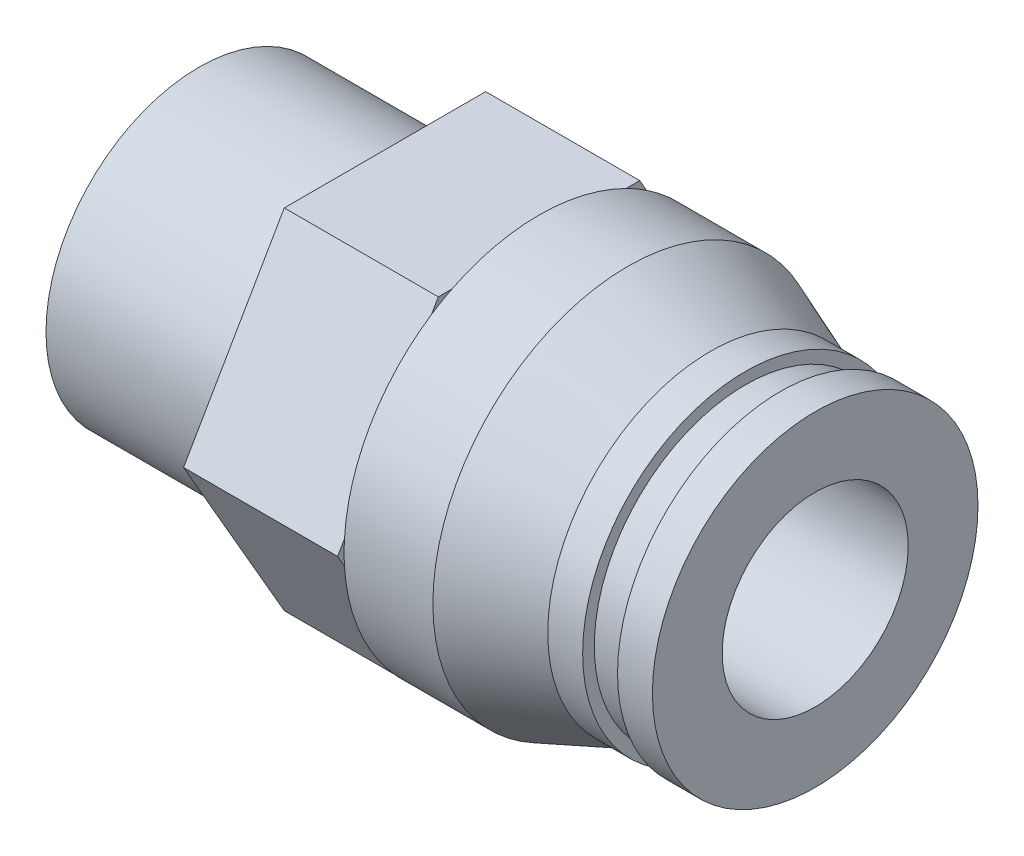
ISO-10303-21;
HEADER;
FILE_DESCRIPTION(('STEP AP214'),'2;1');
FILE_NAME('part.step','',(''),(''),'','','');
FILE_SCHEMA(('AUTOMOTIVE_DESIGN { 1 0 10303 214 1 1 1 1 }'));
ENDSEC;
DATA;
#1=APPLICATION_CONTEXT('core data for automotive mechanical design processes');
#2=APPLICATION_PROTOCOL_DEFINITION('international standard','automotive_design',2000,#1);
#3=PRODUCT_CONTEXT('',#1,'mechanical');
#4=PRODUCT('Part','Part','',(#3));
#5=PRODUCT_RELATED_PRODUCT_CATEGORY('part','',(#4));
#6=PRODUCT_DEFINITION_FORMATION('','',#4);
#7=PRODUCT_DEFINITION_CONTEXT('part definition',#1,'design');
#8=PRODUCT_DEFINITION('design','',#6,#7);
#9=PRODUCT_DEFINITION_SHAPE('','',#8);
#10=(LENGTH_UNIT() NAMED_UNIT(*) SI_UNIT(.MILLI.,.METRE.));
#11=(NAMED_UNIT(*) PLANE_ANGLE_UNIT() SI_UNIT($,.RADIAN.));
#12=(NAMED_UNIT(*) SI_UNIT($,.STERADIAN.) SOLID_ANGLE_UNIT());
#13=UNCERTAINTY_MEASURE_WITH_UNIT(LENGTH_MEASURE(1.E-05),#10,'distance_accuracy_value','');
#14=(GEOMETRIC_REPRESENTATION_CONTEXT(3) GLOBAL_UNCERTAINTY_ASSIGNED_CONTEXT((#13)) GLOBAL_UNIT_ASSIGNED_CONTEXT((#10,
#11,#12)) REPRESENTATION_CONTEXT('',''));
#15=CARTESIAN_POINT('',(0.,0.,0.));
#16=DIRECTION('',(0.,0.,1.));
#17=DIRECTION('',(1.,0.,0.));
#18=AXIS2_PLACEMENT_3D('',#15,#16,#17);
#19=CARTESIAN_POINT('',(8.,6.575,0.));
#20=DIRECTION('',(-1.,0.,0.));
#21=DIRECTION('',(0.,0.,1.));
#22=AXIS2_PLACEMENT_3D('',#19,#20,#21);
#23=PLANE('',#22);
#24=CARTESIAN_POINT('',(8.,0.,0.));
#25=DIRECTION('',(1.,0.,0.));
#26=DIRECTION('',(0.,0.,-1.));
#27=AXIS2_PLACEMENT_3D('',#24,#25,#26);
#28=CIRCLE('',#27,6.575);
#29=CARTESIAN_POINT('',(8.,0.,-6.575));
#30=VERTEX_POINT('',#29);
#31=EDGE_CURVE('E271',#30,#30,#28,.T.);
#32=ORIENTED_EDGE('',*,*,#31,.T.);
#33=EDGE_LOOP('',(#32));
#34=FACE_BOUND('',#33,.T.);
#35=DIRECTION('',(0.,-0.866025403784439,0.5));
#36=VECTOR('',#35,1.);
#37=CARTESIAN_POINT('',(8.,0.,-8.66025403784439));
#38=LINE('',#37,#36);
#39=CARTESIAN_POINT('',(8.,0.,-8.66025403784439));
#40=VERTEX_POINT('',#39);
#41=CARTESIAN_POINT('',(8.,-7.5,-4.33012701892219));
#42=VERTEX_POINT('',#41);
#43=EDGE_CURVE('E165',#40,#42,#38,.T.);
#44=ORIENTED_EDGE('',*,*,#43,.T.);
#45=DIRECTION('',(0.,0.,1.));
#46=VECTOR('',#45,1.);
#47=CARTESIAN_POINT('',(8.,-7.5,-4.33012701892219));
#48=LINE('',#47,#46);
#49=CARTESIAN_POINT('',(8.,-7.5,4.3301270189222));
#50=VERTEX_POINT('',#49);
#51=EDGE_CURVE('E147',#42,#50,#48,.T.);
#52=ORIENTED_EDGE('',*,*,#51,.T.);
#53=DIRECTION('',(0.,0.866025403784439,0.5));
#54=VECTOR('',#53,1.);
#55=CARTESIAN_POINT('',(8.,-7.5,4.3301270189222));
#56=LINE('',#55,#54);
#57=CARTESIAN_POINT('',(8.,0.,8.66025403784439));
#58=VERTEX_POINT('',#57);
#59=EDGE_CURVE('E159',#50,#58,#56,.T.);
#60=ORIENTED_EDGE('',*,*,#59,.T.);
#61=DIRECTION('',(0.,0.866025403784439,-0.5));
#62=VECTOR('',#61,1.);
#63=CARTESIAN_POINT('',(8.,0.,8.66025403784439));
#64=LINE('',#63,#62);
#65=CARTESIAN_POINT('',(8.,7.5,4.33012701892219));
#66=VERTEX_POINT('',#65);
#67=EDGE_CURVE('E31',#58,#66,#64,.T.);
#68=ORIENTED_EDGE('',*,*,#67,.T.);
#69=DIRECTION('',(0.,0.,-1.));
#70=VECTOR('',#69,1.);
#71=CARTESIAN_POINT('',(8.,7.5,4.33012701892219));
#72=LINE('',#71,#70);
#73=CARTESIAN_POINT('',(8.,7.5,-4.3301270189222));
#74=VERTEX_POINT('',#73);
#75=EDGE_CURVE('E169',#66,#74,#72,.T.);
#76=ORIENTED_EDGE('',*,*,#75,.T.);
#77=DIRECTION('',(0.,-0.866025403784439,-0.5));
#78=VECTOR('',#77,1.);
#79=CARTESIAN_POINT('',(8.,7.5,-4.3301270189222));
#80=LINE('',#79,#78);
#81=EDGE_CURVE('E172',#74,#40,#80,.T.);
#82=ORIENTED_EDGE('',*,*,#81,.T.);
#83=EDGE_LOOP('',(#44,#52,#60,#68,#76,#82));
#84=FACE_BOUND('',#83,.T.);
#85=ADVANCED_FACE('F16',(#34,#84),#23,.T.);
#86=CARTESIAN_POINT('',(14.625,9.5,0.));
#87=DIRECTION('',(1.,0.,0.));
#88=DIRECTION('',(0.,0.,-1.));
#89=AXIS2_PLACEMENT_3D('',#86,#87,#88);
#90=PLANE('',#89);
#91=CARTESIAN_POINT('',(14.625,0.,0.));
#92=DIRECTION('',(1.,0.,0.));
#93=DIRECTION('',(0.,0.,-1.));
#94=AXIS2_PLACEMENT_3D('',#91,#92,#93);
#95=CIRCLE('',#94,8.38207981062587);
#96=CARTESIAN_POINT('',(14.625,-7.5,-3.7428948624964));
#97=VERTEX_POINT('',#96);
#98=CARTESIAN_POINT('',(14.625,-6.99144203461614,-4.62374309713509));
#99=VERTEX_POINT('',#98);
#100=EDGE_CURVE('E382',#97,#99,#95,.T.);
#101=ORIENTED_EDGE('',*,*,#100,.F.);
#102=DIRECTION('',(0.,0.,1.));
#103=VECTOR('',#102,1.);
#104=CARTESIAN_POINT('',(14.625,-7.5,-4.33012701892219));
#105=LINE('',#104,#103);
#106=CARTESIAN_POINT('',(14.625,-7.5,-4.33012701892219));
#107=VERTEX_POINT('',#106);
#108=EDGE_CURVE('E175',#107,#97,#105,.T.);
#109=ORIENTED_EDGE('',*,*,#108,.F.);
#110=DIRECTION('',(0.,-0.866025403784439,0.5));
#111=VECTOR('',#110,1.);
#112=CARTESIAN_POINT('',(14.625,0.,-8.66025403784439));
#113=LINE('',#112,#111);
#114=EDGE_CURVE('E195',#99,#107,#113,.T.);
#115=ORIENTED_EDGE('',*,*,#114,.F.);
#116=EDGE_LOOP('',(#101,#109,#115));
#117=FACE_BOUND('',#116,.T.);
#118=ADVANCED_FACE('F326',(#117),#90,.T.);
#119=CARTESIAN_POINT('',(14.625,-0.508557965383857,-8.36663795963149));
#120=VERTEX_POINT('',#119);
#121=CARTESIAN_POINT('',(14.625,0.50855796538386,-8.36663795963149));
#122=VERTEX_POINT('',#121);
#123=EDGE_CURVE('E267',#120,#122,#95,.T.);
#124=ORIENTED_EDGE('',*,*,#123,.F.);
#125=CARTESIAN_POINT('',(14.625,0.,-8.66025403784439));
#126=VERTEX_POINT('',#125);
#127=EDGE_CURVE('E156',#126,#120,#113,.T.);
#128=ORIENTED_EDGE('',*,*,#127,.F.);
#129=DIRECTION('',(0.,-0.866025403784439,-0.5));
#130=VECTOR('',#129,1.);
#131=CARTESIAN_POINT('',(14.625,7.5,-4.3301270189222));
#132=LINE('',#131,#130);
#133=EDGE_CURVE('E190',#122,#126,#132,.T.);
#134=ORIENTED_EDGE('',*,*,#133,.F.);
#135=EDGE_LOOP('',(#124,#128,#134));
#136=FACE_BOUND('',#135,.T.);
#137=ADVANCED_FACE('F332',(#136),#90,.T.);
#138=CARTESIAN_POINT('',(14.625,6.99144203461614,-4.62374309713509));
#139=VERTEX_POINT('',#138);
#140=CARTESIAN_POINT('',(14.625,7.5,-3.74289486249639));
#141=VERTEX_POINT('',#140);
#142=EDGE_CURVE('E272',#139,#141,#95,.T.);
#143=ORIENTED_EDGE('',*,*,#142,.F.);
#144=CARTESIAN_POINT('',(14.625,7.5,-4.3301270189222));
#145=VERTEX_POINT('',#144);
#146=EDGE_CURVE('E192',#145,#139,#132,.T.);
#147=ORIENTED_EDGE('',*,*,#146,.F.);
#148=DIRECTION('',(0.,0.,-1.));
#149=VECTOR('',#148,1.);
#150=CARTESIAN_POINT('',(14.625,7.5,4.33012701892219));
#151=LINE('',#150,#149);
#152=EDGE_CURVE('E185',#141,#145,#151,.T.);
#153=ORIENTED_EDGE('',*,*,#152,.F.);
#154=EDGE_LOOP('',(#143,#147,#153));
#155=FACE_BOUND('',#154,.T.);
#156=ADVANCED_FACE('F444',(#155),#90,.T.);
#157=CARTESIAN_POINT('',(14.625,7.5,3.74289486249639));
#158=VERTEX_POINT('',#157);
#159=CARTESIAN_POINT('',(14.625,6.99144203461614,4.62374309713509));
#160=VERTEX_POINT('',#159);
#161=EDGE_CURVE('E379',#158,#160,#95,.T.);
#162=ORIENTED_EDGE('',*,*,#161,.F.);
#163=CARTESIAN_POINT('',(14.625,7.5,4.33012701892219));
#164=VERTEX_POINT('',#163);
#165=EDGE_CURVE('E187',#164,#158,#151,.T.);
#166=ORIENTED_EDGE('',*,*,#165,.F.);
#167=DIRECTION('',(0.,0.866025403784439,-0.5));
#168=VECTOR('',#167,1.);
#169=CARTESIAN_POINT('',(14.625,0.,8.66025403784439));
#170=LINE('',#169,#168);
#171=EDGE_CURVE('E182',#160,#164,#170,.T.);
#172=ORIENTED_EDGE('',*,*,#171,.F.);
#173=EDGE_LOOP('',(#162,#166,#172));
#174=FACE_BOUND('',#173,.T.);
#175=ADVANCED_FACE('F362',(#174),#90,.T.);
#176=CARTESIAN_POINT('',(14.625,0.508557965383864,8.36663795963149));
#177=VERTEX_POINT('',#176);
#178=CARTESIAN_POINT('',(14.625,-0.508557965383863,8.36663795963149));
#179=VERTEX_POINT('',#178);
#180=EDGE_CURVE('E373',#177,#179,#95,.T.);
#181=ORIENTED_EDGE('',*,*,#180,.F.);
#182=CARTESIAN_POINT('',(14.625,0.,8.66025403784439));
#183=VERTEX_POINT('',#182);
#184=EDGE_CURVE('E37',#183,#177,#170,.T.);
#185=ORIENTED_EDGE('',*,*,#184,.F.);
#186=DIRECTION('',(0.,0.866025403784439,0.5));
#187=VECTOR('',#186,1.);
#188=CARTESIAN_POINT('',(14.625,-7.5,4.3301270189222));
#189=LINE('',#188,#187);
#190=EDGE_CURVE('E178',#179,#183,#189,.T.);
#191=ORIENTED_EDGE('',*,*,#190,.F.);
#192=EDGE_LOOP('',(#181,#185,#191));
#193=FACE_BOUND('',#192,.T.);
#194=ADVANCED_FACE('F357',(#193),#90,.T.);
#195=CARTESIAN_POINT('',(14.625,-7.5,4.3301270189222));
#196=VERTEX_POINT('',#195);
#197=CARTESIAN_POINT('',(14.625,-6.99144203461614,4.62374309713509));
#198=VERTEX_POINT('',#197);
#199=EDGE_CURVE('E180',#196,#198,#189,.T.);
#200=ORIENTED_EDGE('',*,*,#199,.F.);
#201=CARTESIAN_POINT('',(14.625,-7.5,3.74289486249639));
#202=VERTEX_POINT('',#201);
#203=EDGE_CURVE('E151',#202,#196,#105,.T.);
#204=ORIENTED_EDGE('',*,*,#203,.F.);
#205=EDGE_CURVE('E366',#198,#202,#95,.T.);
#206=ORIENTED_EDGE('',*,*,#205,.F.);
#207=EDGE_LOOP('',(#200,#204,#206));
#208=FACE_BOUND('',#207,.T.);
#209=ADVANCED_FACE('F335',(#208),#90,.T.);
#210=CARTESIAN_POINT('',(0.,0.,0.));
#211=DIRECTION('',(-1.,0.,0.));
#212=DIRECTION('',(0.,0.,1.));
#213=AXIS2_PLACEMENT_3D('',#210,#211,#212);
#214=PLANE('',#213);
#215=CARTESIAN_POINT('',(0.,0.,0.));
#216=DIRECTION('',(1.,0.,0.));
#217=DIRECTION('',(0.,0.,-1.));
#218=AXIS2_PLACEMENT_3D('',#215,#216,#217);
#219=CIRCLE('',#218,6.575);
#220=CARTESIAN_POINT('',(0.,0.,-6.575));
#221=VERTEX_POINT('',#220);
#222=EDGE_CURVE('E275',#221,#221,#219,.T.);
#223=ORIENTED_EDGE('',*,*,#222,.F.);
#224=EDGE_LOOP('',(#223));
#225=FACE_BOUND('',#224,.T.);
#226=DIRECTION('',(0.,-0.866025403784439,-0.5));
#227=VECTOR('',#226,1.);
#228=CARTESIAN_POINT('',(0.,0.,3.46410161513775));
#229=LINE('',#228,#227);
#230=CARTESIAN_POINT('',(0.,0.,3.46410161513775));
#231=VERTEX_POINT('',#230);
#232=CARTESIAN_POINT('',(0.,-3.,1.73205080756888));
#233=VERTEX_POINT('',#232);
#234=EDGE_CURVE('E224',#231,#233,#229,.T.);
#235=ORIENTED_EDGE('',*,*,#234,.T.);
#236=DIRECTION('',(0.,0.,-1.));
#237=VECTOR('',#236,1.);
#238=CARTESIAN_POINT('',(0.,-3.,1.73205080756888));
#239=LINE('',#238,#237);
#240=CARTESIAN_POINT('',(0.,-3.,-1.73205080756888));
#241=VERTEX_POINT('',#240);
#242=EDGE_CURVE('E202',#233,#241,#239,.T.);
#243=ORIENTED_EDGE('',*,*,#242,.T.);
#244=DIRECTION('',(0.,0.866025403784438,-0.5));
#245=VECTOR('',#244,1.);
#246=CARTESIAN_POINT('',(0.,-3.,-1.73205080756888));
#247=LINE('',#246,#245);
#248=CARTESIAN_POINT('',(0.,0.,-3.46410161513776));
#249=VERTEX_POINT('',#248);
#250=EDGE_CURVE('E212',#241,#249,#247,.T.);
#251=ORIENTED_EDGE('',*,*,#250,.T.);
#252=DIRECTION('',(0.,0.866025403784438,0.5));
#253=VECTOR('',#252,1.);
#254=CARTESIAN_POINT('',(0.,0.,-3.46410161513776));
#255=LINE('',#254,#253);
#256=CARTESIAN_POINT('',(0.,3.,-1.73205080756888));
#257=VERTEX_POINT('',#256);
#258=EDGE_CURVE('E215',#249,#257,#255,.T.);
#259=ORIENTED_EDGE('',*,*,#258,.T.);
#260=DIRECTION('',(0.,0.,1.));
#261=VECTOR('',#260,1.);
#262=CARTESIAN_POINT('',(0.,3.,-1.73205080756888));
#263=LINE('',#262,#261);
#264=CARTESIAN_POINT('',(0.,3.,1.73205080756888));
#265=VERTEX_POINT('',#264);
#266=EDGE_CURVE('E218',#257,#265,#263,.T.);
#267=ORIENTED_EDGE('',*,*,#266,.T.);
#268=DIRECTION('',(0.,-0.866025403784439,0.5));
#269=VECTOR('',#268,1.);
#270=CARTESIAN_POINT('',(0.,3.,1.73205080756888));
#271=LINE('',#270,#269);
#272=EDGE_CURVE('E221',#265,#231,#271,.T.);
#273=ORIENTED_EDGE('',*,*,#272,.T.);
#274=EDGE_LOOP('',(#235,#243,#251,#259,#267,#273));
#275=FACE_BOUND('',#274,.T.);
#276=ADVANCED_FACE('F18',(#225,#275),#214,.T.);
#277=CARTESIAN_POINT('',(9.,4.,0.));
#278=DIRECTION('',(1.,0.,0.));
#279=DIRECTION('',(0.,0.,-1.));
#280=AXIS2_PLACEMENT_3D('',#277,#278,#279);
#281=PLANE('',#280);
#282=CARTESIAN_POINT('',(9.,0.,0.));
#283=DIRECTION('',(1.,0.,0.));
#284=DIRECTION('',(0.,0.,-1.));
#285=AXIS2_PLACEMENT_3D('',#282,#283,#284);
#286=CIRCLE('',#285,4.);
#287=CARTESIAN_POINT('',(9.,0.,-4.));
#288=VERTEX_POINT('',#287);
#289=EDGE_CURVE('E240',#288,#288,#286,.T.);
#290=ORIENTED_EDGE('',*,*,#289,.T.);
#291=EDGE_LOOP('',(#290));
#292=FACE_BOUND('',#291,.T.);
#293=DIRECTION('',(0.,-0.866025403784438,0.5));
#294=VECTOR('',#293,1.);
#295=CARTESIAN_POINT('',(9.,1.5,-4.3301270189222));
#296=LINE('',#295,#294);
#297=CARTESIAN_POINT('',(9.,0.,-3.46410161513776));
#298=VERTEX_POINT('',#297);
#299=CARTESIAN_POINT('',(9.,-3.,-1.73205080756888));
#300=VERTEX_POINT('',#299);
#301=EDGE_CURVE('E24',#298,#300,#296,.T.);
#302=ORIENTED_EDGE('',*,*,#301,.T.);
#303=DIRECTION('',(0.,0.,1.));
#304=VECTOR('',#303,1.);
#305=CARTESIAN_POINT('',(9.,-3.,0.));
#306=LINE('',#305,#304);
#307=CARTESIAN_POINT('',(9.,-3.,1.73205080756888));
#308=VERTEX_POINT('',#307);
#309=EDGE_CURVE('E10',#300,#308,#306,.T.);
#310=ORIENTED_EDGE('',*,*,#309,.T.);
#311=DIRECTION('',(0.,0.866025403784439,0.5));
#312=VECTOR('',#311,1.);
#313=CARTESIAN_POINT('',(9.,1.5,4.33012701892219));
#314=LINE('',#313,#312);
#315=CARTESIAN_POINT('',(9.,0.,3.46410161513775));
#316=VERTEX_POINT('',#315);
#317=EDGE_CURVE('E278',#308,#316,#314,.T.);
#318=ORIENTED_EDGE('',*,*,#317,.T.);
#319=DIRECTION('',(0.,0.866025403784439,-0.5));
#320=VECTOR('',#319,1.);
#321=CARTESIAN_POINT('',(9.,4.5,0.866025403784437));
#322=LINE('',#321,#320);
#323=CARTESIAN_POINT('',(9.,3.,1.73205080756888));
#324=VERTEX_POINT('',#323);
#325=EDGE_CURVE('E281',#316,#324,#322,.T.);
#326=ORIENTED_EDGE('',*,*,#325,.T.);
#327=DIRECTION('',(0.,0.,-1.));
#328=VECTOR('',#327,1.);
#329=CARTESIAN_POINT('',(9.,3.,0.));
#330=LINE('',#329,#328);
#331=CARTESIAN_POINT('',(9.,3.,-1.73205080756888));
#332=VERTEX_POINT('',#331);
#333=EDGE_CURVE('E284',#324,#332,#330,.T.);
#334=ORIENTED_EDGE('',*,*,#333,.T.);
#335=DIRECTION('',(0.,-0.866025403784439,-0.5));
#336=VECTOR('',#335,1.);
#337=CARTESIAN_POINT('',(9.,4.5,-0.866025403784439));
#338=LINE('',#337,#336);
#339=EDGE_CURVE('E287',#332,#298,#338,.T.);
#340=ORIENTED_EDGE('',*,*,#339,.T.);
#341=EDGE_LOOP('',(#302,#310,#318,#326,#334,#340));
#342=FACE_BOUND('',#341,.T.);
#343=ADVANCED_FACE('F291',(#292,#342),#281,.T.);
#344=CARTESIAN_POINT('',(0.,0.,0.));
#345=DIRECTION('',(1.,0.,0.));
#346=DIRECTION('',(0.,0.,-1.));
#347=AXIS2_PLACEMENT_3D('',#344,#345,#346);
#348=CYLINDRICAL_SURFACE('',#347,6.575);
#349=ORIENTED_EDGE('',*,*,#222,.T.);
#350=EDGE_LOOP('',(#349));
#351=FACE_BOUND('',#350,.T.);
#352=ORIENTED_EDGE('',*,*,#31,.F.);
#353=EDGE_LOOP('',(#352));
#354=FACE_BOUND('',#353,.T.);
#355=ADVANCED_FACE('F337',(#351,#354),#348,.T.);
#356=CARTESIAN_POINT('',(0.,0.,0.));
#357=DIRECTION('',(1.,0.,0.));
#358=DIRECTION('',(0.,0.,-1.));
#359=AXIS2_PLACEMENT_3D('',#356,#357,#358);
#360=CYLINDRICAL_SURFACE('',#359,8.38207981062587);
#361=EDGE_CURVE('E268',#122,#139,#95,.T.);
#362=ORIENTED_EDGE('',*,*,#361,.T.);
#363=ORIENTED_EDGE('',*,*,#142,.T.);
#364=EDGE_CURVE('E446',#141,#158,#95,.T.);
#365=ORIENTED_EDGE('',*,*,#364,.T.);
#366=ORIENTED_EDGE('',*,*,#161,.T.);
#367=EDGE_CURVE('E378',#160,#177,#95,.T.);
#368=ORIENTED_EDGE('',*,*,#367,.T.);
#369=ORIENTED_EDGE('',*,*,#180,.T.);
#370=EDGE_CURVE('E376',#179,#198,#95,.T.);
#371=ORIENTED_EDGE('',*,*,#370,.T.);
#372=ORIENTED_EDGE('',*,*,#205,.T.);
#373=EDGE_CURVE('E380',#202,#97,#95,.T.);
#374=ORIENTED_EDGE('',*,*,#373,.T.);
#375=ORIENTED_EDGE('',*,*,#100,.T.);
#376=EDGE_CURVE('E384',#99,#120,#95,.T.);
#377=ORIENTED_EDGE('',*,*,#376,.T.);
#378=ORIENTED_EDGE('',*,*,#123,.T.);
#379=EDGE_LOOP('',(#362,#363,#365,#366,#368,#369,#371,#372,#374,#375,#377,#378));
#380=FACE_BOUND('',#379,.T.);
#381=CARTESIAN_POINT('',(18.4420013290129,0.,0.));
#382=DIRECTION('',(1.,0.,0.));
#383=DIRECTION('',(0.,0.,-1.));
#384=AXIS2_PLACEMENT_3D('',#381,#382,#383);
#385=CIRCLE('',#384,8.38207981062587);
#386=CARTESIAN_POINT('',(18.4420013290129,0.,-8.38207981062587));
#387=VERTEX_POINT('',#386);
#388=EDGE_CURVE('E264',#387,#387,#385,.T.);
#389=ORIENTED_EDGE('',*,*,#388,.F.);
#390=EDGE_LOOP('',(#389));
#391=FACE_BOUND('',#390,.T.);
#392=ADVANCED_FACE('F339',(#380,#391),#360,.T.);
#393=CARTESIAN_POINT('',(22.,0.,0.));
#394=DIRECTION('',(-1.,0.,0.));
#395=DIRECTION('',(0.,0.,1.));
#396=AXIS2_PLACEMENT_3D('',#393,#394,#395);
#397=CONICAL_SURFACE('',#396,7.,0.370503949260781);
#398=ORIENTED_EDGE('',*,*,#388,.T.);
#399=EDGE_LOOP('',(#398));
#400=FACE_BOUND('',#399,.T.);
#401=CARTESIAN_POINT('',(22.,0.,0.));
#402=DIRECTION('',(1.,0.,0.));
#403=DIRECTION('',(0.,0.,-1.));
#404=AXIS2_PLACEMENT_3D('',#401,#402,#403);
#405=CIRCLE('',#404,7.);
#406=CARTESIAN_POINT('',(22.,0.,-7.));
#407=VERTEX_POINT('',#406);
#408=EDGE_CURVE('E261',#407,#407,#405,.T.);
#409=ORIENTED_EDGE('',*,*,#408,.F.);
#410=EDGE_LOOP('',(#409));
#411=FACE_BOUND('',#410,.T.);
#412=ADVANCED_FACE('F345',(#400,#411),#397,.T.);
#413=CARTESIAN_POINT('',(0.,0.,0.));
#414=DIRECTION('',(1.,0.,0.));
#415=DIRECTION('',(0.,0.,-1.));
#416=AXIS2_PLACEMENT_3D('',#413,#414,#415);
#417=CYLINDRICAL_SURFACE('',#416,7.);
#418=ORIENTED_EDGE('',*,*,#408,.T.);
#419=EDGE_LOOP('',(#418));
#420=FACE_BOUND('',#419,.T.);
#421=CARTESIAN_POINT('',(23.5,0.,0.));
#422=DIRECTION('',(1.,0.,0.));
#423=DIRECTION('',(0.,0.,-1.));
#424=AXIS2_PLACEMENT_3D('',#421,#422,#423);
#425=CIRCLE('',#424,7.);
#426=CARTESIAN_POINT('',(23.5,0.,-7.));
#427=VERTEX_POINT('',#426);
#428=EDGE_CURVE('E258',#427,#427,#425,.T.);
#429=ORIENTED_EDGE('',*,*,#428,.F.);
#430=EDGE_LOOP('',(#429));
#431=FACE_BOUND('',#430,.T.);
#432=ADVANCED_FACE('F601',(#420,#431),#417,.T.);
#433=CARTESIAN_POINT('',(23.5,7.,0.));
#434=DIRECTION('',(1.,0.,0.));
#435=DIRECTION('',(0.,0.,-1.));
#436=AXIS2_PLACEMENT_3D('',#433,#434,#435);
#437=PLANE('',#436);
#438=ORIENTED_EDGE('',*,*,#428,.T.);
#439=EDGE_LOOP('',(#438));
#440=FACE_BOUND('',#439,.T.);
#441=CARTESIAN_POINT('',(23.5,0.,0.));
#442=DIRECTION('',(1.,0.,0.));
#443=DIRECTION('',(0.,0.,-1.));
#444=AXIS2_PLACEMENT_3D('',#441,#442,#443);
#445=CIRCLE('',#444,6.5);
#446=CARTESIAN_POINT('',(23.5,0.,-6.5));
#447=VERTEX_POINT('',#446);
#448=EDGE_CURVE('E255',#447,#447,#445,.T.);
#449=ORIENTED_EDGE('',*,*,#448,.F.);
#450=EDGE_LOOP('',(#449));
#451=FACE_BOUND('',#450,.T.);
#452=ADVANCED_FACE('F591',(#440,#451),#437,.T.);
#453=CARTESIAN_POINT('',(0.,0.,0.));
#454=DIRECTION('',(1.,0.,0.));
#455=DIRECTION('',(0.,0.,-1.));
#456=AXIS2_PLACEMENT_3D('',#453,#454,#455);
#457=CYLINDRICAL_SURFACE('',#456,6.5);
#458=ORIENTED_EDGE('',*,*,#448,.T.);
#459=EDGE_LOOP('',(#458));
#460=FACE_BOUND('',#459,.T.);
#461=CARTESIAN_POINT('',(25.,0.,0.));
#462=DIRECTION('',(1.,0.,0.));
#463=DIRECTION('',(0.,0.,-1.));
#464=AXIS2_PLACEMENT_3D('',#461,#462,#463);
#465=CIRCLE('',#464,6.5);
#466=CARTESIAN_POINT('',(25.,0.,-6.5));
#467=VERTEX_POINT('',#466);
#468=EDGE_CURVE('E252',#467,#467,#465,.T.);
#469=ORIENTED_EDGE('',*,*,#468,.F.);
#470=EDGE_LOOP('',(#469));
#471=FACE_BOUND('',#470,.T.);
#472=ADVANCED_FACE('F581',(#460,#471),#457,.T.);
#473=CARTESIAN_POINT('',(25.,6.5,0.));
#474=DIRECTION('',(-1.,0.,0.));
#475=DIRECTION('',(0.,0.,1.));
#476=AXIS2_PLACEMENT_3D('',#473,#474,#475);
#477=PLANE('',#476);
#478=ORIENTED_EDGE('',*,*,#468,.T.);
#479=EDGE_LOOP('',(#478));
#480=FACE_BOUND('',#479,.T.);
#481=CARTESIAN_POINT('',(25.,0.,0.));
#482=DIRECTION('',(1.,0.,0.));
#483=DIRECTION('',(0.,0.,-1.));
#484=AXIS2_PLACEMENT_3D('',#481,#482,#483);
#485=CIRCLE('',#484,7.);
#486=CARTESIAN_POINT('',(25.,0.,-7.));
#487=VERTEX_POINT('',#486);
#488=EDGE_CURVE('E249',#487,#487,#485,.T.);
#489=ORIENTED_EDGE('',*,*,#488,.F.);
#490=EDGE_LOOP('',(#489));
#491=FACE_BOUND('',#490,.T.);
#492=ADVANCED_FACE('F571',(#480,#491),#477,.T.);
#493=CARTESIAN_POINT('',(0.,0.,0.));
#494=DIRECTION('',(1.,0.,0.));
#495=DIRECTION('',(0.,0.,-1.));
#496=AXIS2_PLACEMENT_3D('',#493,#494,#495);
#497=CYLINDRICAL_SURFACE('',#496,7.);
#498=ORIENTED_EDGE('',*,*,#488,.T.);
#499=EDGE_LOOP('',(#498));
#500=FACE_BOUND('',#499,.T.);
#501=CARTESIAN_POINT('',(26.5,0.,0.));
#502=DIRECTION('',(1.,0.,0.));
#503=DIRECTION('',(0.,0.,-1.));
#504=AXIS2_PLACEMENT_3D('',#501,#502,#503);
#505=CIRCLE('',#504,7.);
#506=CARTESIAN_POINT('',(26.5,0.,-7.));
#507=VERTEX_POINT('',#506);
#508=EDGE_CURVE('E246',#507,#507,#505,.T.);
#509=ORIENTED_EDGE('',*,*,#508,.F.);
#510=EDGE_LOOP('',(#509));
#511=FACE_BOUND('',#510,.T.);
#512=ADVANCED_FACE('F561',(#500,#511),#497,.T.);
#513=CARTESIAN_POINT('',(26.5,7.,0.));
#514=DIRECTION('',(1.,0.,0.));
#515=DIRECTION('',(0.,0.,-1.));
#516=AXIS2_PLACEMENT_3D('',#513,#514,#515);
#517=PLANE('',#516);
#518=ORIENTED_EDGE('',*,*,#508,.T.);
#519=EDGE_LOOP('',(#518));
#520=FACE_BOUND('',#519,.T.);
#521=CARTESIAN_POINT('',(26.5,0.,0.));
#522=DIRECTION('',(1.,0.,0.));
#523=DIRECTION('',(0.,0.,-1.));
#524=AXIS2_PLACEMENT_3D('',#521,#522,#523);
#525=CIRCLE('',#524,4.);
#526=CARTESIAN_POINT('',(26.5,0.,-4.));
#527=VERTEX_POINT('',#526);
#528=EDGE_CURVE('E243',#527,#527,#525,.T.);
#529=ORIENTED_EDGE('',*,*,#528,.F.);
#530=EDGE_LOOP('',(#529));
#531=FACE_BOUND('',#530,.T.);
#532=ADVANCED_FACE('F551',(#520,#531),#517,.T.);
#533=CARTESIAN_POINT('',(0.,0.,0.));
#534=DIRECTION('',(1.,0.,0.));
#535=DIRECTION('',(0.,0.,-1.));
#536=AXIS2_PLACEMENT_3D('',#533,#534,#535);
#537=CYLINDRICAL_SURFACE('',#536,4.);
#538=ORIENTED_EDGE('',*,*,#528,.T.);
#539=EDGE_LOOP('',(#538));
#540=FACE_BOUND('',#539,.T.);
#541=ORIENTED_EDGE('',*,*,#289,.F.);
#542=EDGE_LOOP('',(#541));
#543=FACE_BOUND('',#542,.T.);
#544=ADVANCED_FACE('F542',(#540,#543),#537,.F.);
#545=CARTESIAN_POINT('',(26.5,-3.,1.73205080756888));
#546=DIRECTION('',(0.,1.,0.));
#547=DIRECTION('',(0.,0.,1.));
#548=AXIS2_PLACEMENT_3D('',#545,#546,#547);
#549=PLANE('',#548);
#550=DIRECTION('',(-1.,0.,0.));
#551=VECTOR('',#550,1.);
#552=CARTESIAN_POINT('',(26.5,-3.,-1.73205080756888));
#553=LINE('',#552,#551);
#554=EDGE_CURVE('E238',#300,#241,#553,.T.);
#555=ORIENTED_EDGE('',*,*,#554,.T.);
#556=ORIENTED_EDGE('',*,*,#242,.F.);
#557=DIRECTION('',(-1.,0.,0.));
#558=VECTOR('',#557,1.);
#559=CARTESIAN_POINT('',(26.5,-3.,1.73205080756888));
#560=LINE('',#559,#558);
#561=EDGE_CURVE('E227',#308,#233,#560,.T.);
#562=ORIENTED_EDGE('',*,*,#561,.F.);
#563=ORIENTED_EDGE('',*,*,#309,.F.);
#564=EDGE_LOOP('',(#555,#556,#562,#563));
#565=FACE_BOUND('',#564,.T.);
#566=ADVANCED_FACE('F306',(#565),#549,.T.);
#567=CARTESIAN_POINT('',(26.5,-3.,-1.73205080756888));
#568=DIRECTION('',(0.,0.5,0.866025403784439));
#569=DIRECTION('',(0.,-0.866025403784438,0.5));
#570=AXIS2_PLACEMENT_3D('',#567,#568,#569);
#571=PLANE('',#570);
#572=DIRECTION('',(-1.,0.,0.));
#573=VECTOR('',#572,1.);
#574=CARTESIAN_POINT('',(26.5,0.,-3.46410161513776));
#575=LINE('',#574,#573);
#576=EDGE_CURVE('E236',#298,#249,#575,.T.);
#577=ORIENTED_EDGE('',*,*,#576,.T.);
#578=ORIENTED_EDGE('',*,*,#250,.F.);
#579=ORIENTED_EDGE('',*,*,#554,.F.);
#580=ORIENTED_EDGE('',*,*,#301,.F.);
#581=EDGE_LOOP('',(#577,#578,#579,#580));
#582=FACE_BOUND('',#581,.T.);
#583=ADVANCED_FACE('F295',(#582),#571,.T.);
#584=CARTESIAN_POINT('',(26.5,0.,-3.46410161513776));
#585=DIRECTION('',(0.,-0.5,0.866025403784439));
#586=DIRECTION('',(0.,-0.866025403784439,-0.5));
#587=AXIS2_PLACEMENT_3D('',#584,#585,#586);
#588=PLANE('',#587);
#589=DIRECTION('',(-1.,0.,0.));
#590=VECTOR('',#589,1.);
#591=CARTESIAN_POINT('',(26.5,3.,-1.73205080756888));
#592=LINE('',#591,#590);
#593=EDGE_CURVE('E234',#332,#257,#592,.T.);
#594=ORIENTED_EDGE('',*,*,#593,.T.);
#595=ORIENTED_EDGE('',*,*,#258,.F.);
#596=ORIENTED_EDGE('',*,*,#576,.F.);
#597=ORIENTED_EDGE('',*,*,#339,.F.);
#598=EDGE_LOOP('',(#594,#595,#596,#597));
#599=FACE_BOUND('',#598,.T.);
#600=ADVANCED_FACE('F299',(#599),#588,.T.);
#601=CARTESIAN_POINT('',(26.5,3.,-1.73205080756888));
#602=DIRECTION('',(0.,-1.,0.));
#603=DIRECTION('',(0.,0.,-1.));
#604=AXIS2_PLACEMENT_3D('',#601,#602,#603);
#605=PLANE('',#604);
#606=DIRECTION('',(-1.,0.,0.));
#607=VECTOR('',#606,1.);
#608=CARTESIAN_POINT('',(26.5,3.,1.73205080756888));
#609=LINE('',#608,#607);
#610=EDGE_CURVE('E232',#324,#265,#609,.T.);
#611=ORIENTED_EDGE('',*,*,#610,.T.);
#612=ORIENTED_EDGE('',*,*,#266,.F.);
#613=ORIENTED_EDGE('',*,*,#593,.F.);
#614=ORIENTED_EDGE('',*,*,#333,.F.);
#615=EDGE_LOOP('',(#611,#612,#613,#614));
#616=FACE_BOUND('',#615,.T.);
#617=ADVANCED_FACE('F315',(#616),#605,.T.);
#618=CARTESIAN_POINT('',(26.5,3.,1.73205080756888));
#619=DIRECTION('',(0.,-0.5,-0.866025403784439));
#620=DIRECTION('',(0.,0.866025403784439,-0.5));
#621=AXIS2_PLACEMENT_3D('',#618,#619,#620);
#622=PLANE('',#621);
#623=DIRECTION('',(-1.,0.,0.));
#624=VECTOR('',#623,1.);
#625=CARTESIAN_POINT('',(26.5,0.,3.46410161513775));
#626=LINE('',#625,#624);
#627=EDGE_CURVE('E230',#316,#231,#626,.T.);
#628=ORIENTED_EDGE('',*,*,#627,.T.);
#629=ORIENTED_EDGE('',*,*,#272,.F.);
#630=ORIENTED_EDGE('',*,*,#610,.F.);
#631=ORIENTED_EDGE('',*,*,#325,.F.);
#632=EDGE_LOOP('',(#628,#629,#630,#631));
#633=FACE_BOUND('',#632,.T.);
#634=ADVANCED_FACE('F312',(#633),#622,.T.);
#635=CARTESIAN_POINT('',(26.5,0.,3.46410161513775));
#636=DIRECTION('',(0.,0.5,-0.866025403784439));
#637=DIRECTION('',(0.,0.866025403784439,0.5));
#638=AXIS2_PLACEMENT_3D('',#635,#636,#637);
#639=PLANE('',#638);
#640=ORIENTED_EDGE('',*,*,#561,.T.);
#641=ORIENTED_EDGE('',*,*,#234,.F.);
#642=ORIENTED_EDGE('',*,*,#627,.F.);
#643=ORIENTED_EDGE('',*,*,#317,.F.);
#644=EDGE_LOOP('',(#640,#641,#642,#643));
#645=FACE_BOUND('',#644,.T.);
#646=ADVANCED_FACE('F308',(#645),#639,.T.);
#647=CARTESIAN_POINT('',(14.625,0.,0.));
#648=DIRECTION('',(-1.,0.,0.));
#649=DIRECTION('',(0.,0.,1.));
#650=AXIS2_PLACEMENT_3D('',#647,#648,#649);
#651=PLANE('',#650);
#652=EDGE_CURVE('E183',#198,#179,#189,.T.);
#653=ORIENTED_EDGE('',*,*,#652,.F.);
#654=ORIENTED_EDGE('',*,*,#370,.F.);
#655=EDGE_LOOP('',(#653,#654));
#656=FACE_BOUND('',#655,.T.);
#657=ADVANCED_FACE('F418',(#656),#651,.T.);
#658=EDGE_CURVE('E179',#97,#202,#105,.T.);
#659=ORIENTED_EDGE('',*,*,#658,.F.);
#660=ORIENTED_EDGE('',*,*,#373,.F.);
#661=EDGE_LOOP('',(#659,#660));
#662=FACE_BOUND('',#661,.T.);
#663=ADVANCED_FACE('F412',(#662),#651,.T.);
#664=EDGE_CURVE('E199',#120,#99,#113,.T.);
#665=ORIENTED_EDGE('',*,*,#664,.F.);
#666=ORIENTED_EDGE('',*,*,#376,.F.);
#667=EDGE_LOOP('',(#665,#666));
#668=FACE_BOUND('',#667,.T.);
#669=ADVANCED_FACE('F404',(#668),#651,.T.);
#670=EDGE_CURVE('E196',#139,#122,#132,.T.);
#671=ORIENTED_EDGE('',*,*,#670,.F.);
#672=ORIENTED_EDGE('',*,*,#361,.F.);
#673=EDGE_LOOP('',(#671,#672));
#674=FACE_BOUND('',#673,.T.);
#675=ADVANCED_FACE('F401',(#674),#651,.T.);
#676=EDGE_CURVE('E191',#158,#141,#151,.T.);
#677=ORIENTED_EDGE('',*,*,#676,.F.);
#678=ORIENTED_EDGE('',*,*,#364,.F.);
#679=EDGE_LOOP('',(#677,#678));
#680=FACE_BOUND('',#679,.T.);
#681=ADVANCED_FACE('F403',(#680),#651,.T.);
#682=EDGE_CURVE('E186',#177,#160,#170,.T.);
#683=ORIENTED_EDGE('',*,*,#682,.F.);
#684=ORIENTED_EDGE('',*,*,#367,.F.);
#685=EDGE_LOOP('',(#683,#684));
#686=FACE_BOUND('',#685,.T.);
#687=ADVANCED_FACE('F410',(#686),#651,.T.);
#688=CARTESIAN_POINT('',(14.625,-7.5,-4.33012701892219));
#689=DIRECTION('',(0.,-1.,0.));
#690=DIRECTION('',(0.,0.,-1.));
#691=AXIS2_PLACEMENT_3D('',#688,#689,#690);
#692=PLANE('',#691);
#693=DIRECTION('',(-1.,0.,0.));
#694=VECTOR('',#693,1.);
#695=CARTESIAN_POINT('',(14.625,-7.5,-4.33012701892219));
#696=LINE('',#695,#694);
#697=EDGE_CURVE('E200',#107,#42,#696,.T.);
#698=ORIENTED_EDGE('',*,*,#697,.F.);
#699=ORIENTED_EDGE('',*,*,#108,.T.);
#700=ORIENTED_EDGE('',*,*,#658,.T.);
#701=ORIENTED_EDGE('',*,*,#203,.T.);
#702=DIRECTION('',(-1.,0.,0.));
#703=VECTOR('',#702,1.);
#704=CARTESIAN_POINT('',(14.625,-7.5,4.3301270189222));
#705=LINE('',#704,#703);
#706=EDGE_CURVE('E142',#196,#50,#705,.T.);
#707=ORIENTED_EDGE('',*,*,#706,.T.);
#708=ORIENTED_EDGE('',*,*,#51,.F.);
#709=EDGE_LOOP('',(#698,#699,#700,#701,#707,#708));
#710=FACE_BOUND('',#709,.T.);
#711=ADVANCED_FACE('F145',(#710),#692,.T.);
#712=CARTESIAN_POINT('',(14.625,0.,-8.66025403784439));
#713=DIRECTION('',(0.,-0.5,-0.866025403784439));
#714=DIRECTION('',(0.,0.866025403784439,-0.5));
#715=AXIS2_PLACEMENT_3D('',#712,#713,#714);
#716=PLANE('',#715);
#717=DIRECTION('',(-1.,0.,0.));
#718=VECTOR('',#717,1.);
#719=CARTESIAN_POINT('',(14.625,0.,-8.66025403784439));
#720=LINE('',#719,#718);
#721=EDGE_CURVE('E203',#126,#40,#720,.T.);
#722=ORIENTED_EDGE('',*,*,#721,.F.);
#723=ORIENTED_EDGE('',*,*,#127,.T.);
#724=ORIENTED_EDGE('',*,*,#664,.T.);
#725=ORIENTED_EDGE('',*,*,#114,.T.);
#726=ORIENTED_EDGE('',*,*,#697,.T.);
#727=ORIENTED_EDGE('',*,*,#43,.F.);
#728=EDGE_LOOP('',(#722,#723,#724,#725,#726,#727));
#729=FACE_BOUND('',#728,.T.);
#730=ADVANCED_FACE('F434',(#729),#716,.T.);
#731=CARTESIAN_POINT('',(14.625,7.5,-4.3301270189222));
#732=DIRECTION('',(0.,0.5,-0.866025403784439));
#733=DIRECTION('',(0.,0.866025403784439,0.5));
#734=AXIS2_PLACEMENT_3D('',#731,#732,#733);
#735=PLANE('',#734);
#736=DIRECTION('',(-1.,0.,0.));
#737=VECTOR('',#736,1.);
#738=CARTESIAN_POINT('',(14.625,7.5,-4.3301270189222));
#739=LINE('',#738,#737);
#740=EDGE_CURVE('E205',#145,#74,#739,.T.);
#741=ORIENTED_EDGE('',*,*,#740,.F.);
#742=ORIENTED_EDGE('',*,*,#146,.T.);
#743=ORIENTED_EDGE('',*,*,#670,.T.);
#744=ORIENTED_EDGE('',*,*,#133,.T.);
#745=ORIENTED_EDGE('',*,*,#721,.T.);
#746=ORIENTED_EDGE('',*,*,#81,.F.);
#747=EDGE_LOOP('',(#741,#742,#743,#744,#745,#746));
#748=FACE_BOUND('',#747,.T.);
#749=ADVANCED_FACE('F397',(#748),#735,.T.);
#750=CARTESIAN_POINT('',(14.625,7.5,4.33012701892219));
#751=DIRECTION('',(0.,1.,0.));
#752=DIRECTION('',(0.,0.,1.));
#753=AXIS2_PLACEMENT_3D('',#750,#751,#752);
#754=PLANE('',#753);
#755=DIRECTION('',(-1.,0.,0.));
#756=VECTOR('',#755,1.);
#757=CARTESIAN_POINT('',(14.625,7.5,4.33012701892219));
#758=LINE('',#757,#756);
#759=EDGE_CURVE('E207',#164,#66,#758,.T.);
#760=ORIENTED_EDGE('',*,*,#759,.F.);
#761=ORIENTED_EDGE('',*,*,#165,.T.);
#762=ORIENTED_EDGE('',*,*,#676,.T.);
#763=ORIENTED_EDGE('',*,*,#152,.T.);
#764=ORIENTED_EDGE('',*,*,#740,.T.);
#765=ORIENTED_EDGE('',*,*,#75,.F.);
#766=EDGE_LOOP('',(#760,#761,#762,#763,#764,#765));
#767=FACE_BOUND('',#766,.T.);
#768=ADVANCED_FACE('F439',(#767),#754,.T.);
#769=CARTESIAN_POINT('',(14.625,0.,8.66025403784439));
#770=DIRECTION('',(0.,0.5,0.866025403784439));
#771=DIRECTION('',(0.,-0.866025403784438,0.5));
#772=AXIS2_PLACEMENT_3D('',#769,#770,#771);
#773=PLANE('',#772);
#774=DIRECTION('',(-1.,0.,0.));
#775=VECTOR('',#774,1.);
#776=CARTESIAN_POINT('',(14.625,0.,8.66025403784439));
#777=LINE('',#776,#775);
#778=EDGE_CURVE('E155',#183,#58,#777,.T.);
#779=ORIENTED_EDGE('',*,*,#778,.F.);
#780=ORIENTED_EDGE('',*,*,#184,.T.);
#781=ORIENTED_EDGE('',*,*,#682,.T.);
#782=ORIENTED_EDGE('',*,*,#171,.T.);
#783=ORIENTED_EDGE('',*,*,#759,.T.);
#784=ORIENTED_EDGE('',*,*,#67,.F.);
#785=EDGE_LOOP('',(#779,#780,#781,#782,#783,#784));
#786=FACE_BOUND('',#785,.T.);
#787=ADVANCED_FACE('F450',(#786),#773,.T.);
#788=CARTESIAN_POINT('',(14.625,-7.5,4.3301270189222));
#789=DIRECTION('',(0.,-0.5,0.866025403784439));
#790=DIRECTION('',(0.,-0.866025403784439,-0.5));
#791=AXIS2_PLACEMENT_3D('',#788,#789,#790);
#792=PLANE('',#791);
#793=ORIENTED_EDGE('',*,*,#706,.F.);
#794=ORIENTED_EDGE('',*,*,#199,.T.);
#795=ORIENTED_EDGE('',*,*,#652,.T.);
#796=ORIENTED_EDGE('',*,*,#190,.T.);
#797=ORIENTED_EDGE('',*,*,#778,.T.);
#798=ORIENTED_EDGE('',*,*,#59,.F.);
#799=EDGE_LOOP('',(#793,#794,#795,#796,#797,#798));
#800=FACE_BOUND('',#799,.T.);
#801=ADVANCED_FACE('F160',(#800),#792,.T.);
#802=CLOSED_SHELL('',(#85,#118,#137,#156,#175,#194,#209,#276,#343,#355,#392,#412,#432,#452,#472,
#492,#512,#532,#544,#566,#583,#600,#617,#634,#646,#657,#663,#669,#675,#681,#687,#711,#730,#749,
#768,#787,#801));
#803=MANIFOLD_SOLID_BREP('B1',#802);
#804=ADVANCED_BREP_SHAPE_REPRESENTATION('',(#18,#803),#14);
#805=SHAPE_DEFINITION_REPRESENTATION(#9,#804);
ENDSEC;
END-ISO-10303-21;
